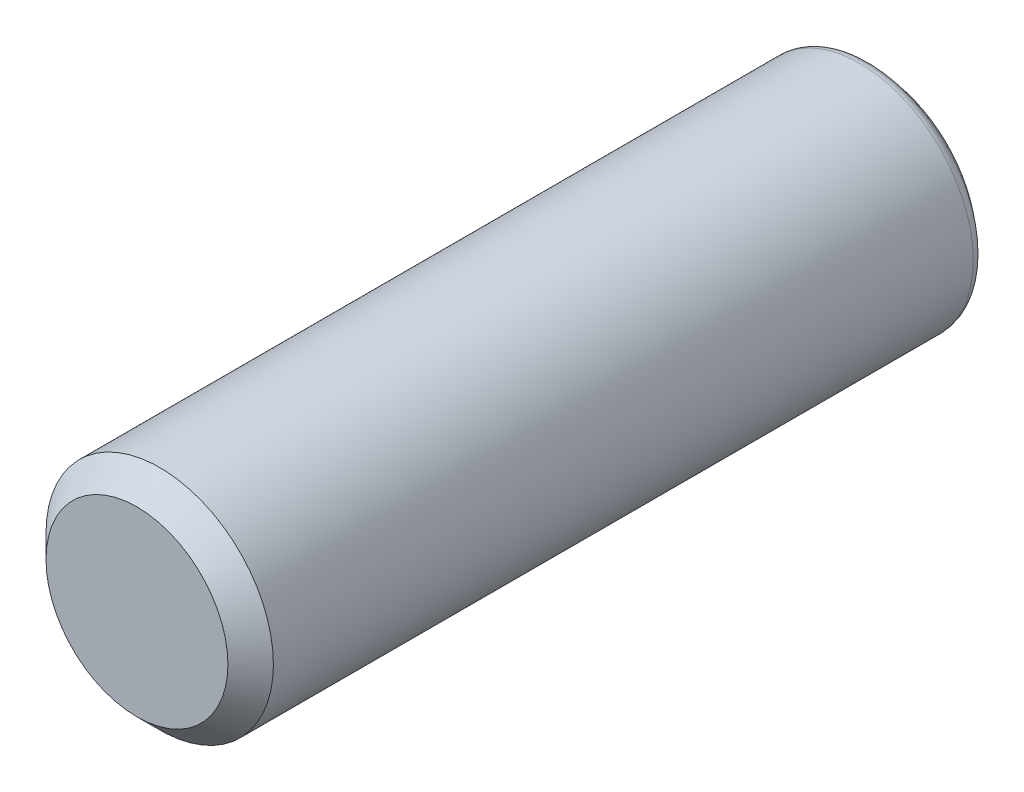
ISO-10303-21;
HEADER;
FILE_DESCRIPTION(('STEP AP214'),'2;1');
FILE_NAME('part.step','',(''),(''),'','','');
FILE_SCHEMA(('AUTOMOTIVE_DESIGN { 1 0 10303 214 1 1 1 1 }'));
ENDSEC;
DATA;
#1=APPLICATION_CONTEXT('core data for automotive mechanical design processes');
#2=APPLICATION_PROTOCOL_DEFINITION('international standard','automotive_design',2000,#1);
#3=PRODUCT_CONTEXT('',#1,'mechanical');
#4=PRODUCT('Part','Part','',(#3));
#5=PRODUCT_RELATED_PRODUCT_CATEGORY('part','',(#4));
#6=PRODUCT_DEFINITION_FORMATION('','',#4);
#7=PRODUCT_DEFINITION_CONTEXT('part definition',#1,'design');
#8=PRODUCT_DEFINITION('design','',#6,#7);
#9=PRODUCT_DEFINITION_SHAPE('','',#8);
#10=(LENGTH_UNIT() NAMED_UNIT(*) SI_UNIT(.MILLI.,.METRE.));
#11=(NAMED_UNIT(*) PLANE_ANGLE_UNIT() SI_UNIT($,.RADIAN.));
#12=(NAMED_UNIT(*) SI_UNIT($,.STERADIAN.) SOLID_ANGLE_UNIT());
#13=UNCERTAINTY_MEASURE_WITH_UNIT(LENGTH_MEASURE(1.E-05),#10,'distance_accuracy_value','');
#14=(GEOMETRIC_REPRESENTATION_CONTEXT(3) GLOBAL_UNCERTAINTY_ASSIGNED_CONTEXT((#13)) GLOBAL_UNIT_ASSIGNED_CONTEXT((#10,
#11,#12)) REPRESENTATION_CONTEXT('',''));
#15=CARTESIAN_POINT('',(0.,0.,0.));
#16=DIRECTION('',(0.,0.,1.));
#17=DIRECTION('',(1.,0.,0.));
#18=AXIS2_PLACEMENT_3D('',#15,#16,#17);
#19=CARTESIAN_POINT('',(0.,0.,32.));
#20=DIRECTION('',(0.,0.,-1.));
#21=DIRECTION('',(-1.,0.,0.));
#22=AXIS2_PLACEMENT_3D('',#19,#20,#21);
#23=CYLINDRICAL_SURFACE('',#22,5.00000000000001);
#24=CARTESIAN_POINT('',(0.,0.,0.21884705062547));
#25=DIRECTION('',(0.,0.,1.));
#26=DIRECTION('',(1.,0.,0.));
#27=AXIS2_PLACEMENT_3D('',#24,#25,#26);
#28=CIRCLE('',#27,5.00000000000001);
#29=CARTESIAN_POINT('',(5.00000000000001,0.,0.21884705062547));
#30=VERTEX_POINT('',#29);
#31=EDGE_CURVE('E38',#30,#30,#28,.T.);
#32=ORIENTED_EDGE('',*,*,#31,.T.);
#33=EDGE_LOOP('',(#32));
#34=FACE_BOUND('',#33,.T.);
#35=CARTESIAN_POINT('',(0.,0.,31.));
#36=DIRECTION('',(0.,0.,1.));
#37=DIRECTION('',(1.,0.,0.));
#38=AXIS2_PLACEMENT_3D('',#35,#36,#37);
#39=CIRCLE('',#38,5.00000000000001);
#40=CARTESIAN_POINT('',(5.00000000000001,0.,31.));
#41=VERTEX_POINT('',#40);
#42=EDGE_CURVE('E42',#41,#41,#39,.F.);
#43=ORIENTED_EDGE('',*,*,#42,.T.);
#44=EDGE_LOOP('',(#43));
#45=FACE_BOUND('',#44,.T.);
#46=ADVANCED_FACE('F31',(#34,#45),#23,.T.);
#47=CARTESIAN_POINT('',(0.,0.,32.));
#48=DIRECTION('',(0.,0.,1.));
#49=DIRECTION('',(1.,0.,0.));
#50=AXIS2_PLACEMENT_3D('',#47,#48,#49);
#51=PLANE('',#50);
#52=CARTESIAN_POINT('',(0.,0.,32.));
#53=DIRECTION('',(0.,0.,1.));
#54=DIRECTION('',(1.,0.,0.));
#55=AXIS2_PLACEMENT_3D('',#52,#53,#54);
#56=CIRCLE('',#55,3.99999999999999);
#57=CARTESIAN_POINT('',(3.99999999999999,0.,32.));
#58=VERTEX_POINT('',#57);
#59=EDGE_CURVE('E46',#58,#58,#56,.T.);
#60=ORIENTED_EDGE('',*,*,#59,.T.);
#61=EDGE_LOOP('',(#60));
#62=FACE_BOUND('',#61,.T.);
#63=ADVANCED_FACE('F52',(#62),#51,.T.);
#64=CARTESIAN_POINT('',(0.,0.,5.25000000000001));
#65=DIRECTION('',(0.,0.,1.));
#66=DIRECTION('',(1.,0.,0.));
#67=AXIS2_PLACEMENT_3D('',#64,#65,#66);
#68=SPHERICAL_SURFACE('',#67,7.25000000000001);
#69=CARTESIAN_POINT('',(0.,0.,-0.153830945624493));
#70=DIRECTION('',(0.,0.,1.));
#71=DIRECTION('',(1.,0.,0.));
#72=AXIS2_PLACEMENT_3D('',#69,#70,#71);
#73=CIRCLE('',#72,4.83333333333334);
#74=CARTESIAN_POINT('',(4.83333333333334,0.,-0.153830945624493));
#75=VERTEX_POINT('',#74);
#76=EDGE_CURVE('E10',#75,#75,#73,.F.);
#77=ORIENTED_EDGE('',*,*,#76,.T.);
#78=EDGE_LOOP('',(#77));
#79=FACE_BOUND('',#78,.T.);
#80=ADVANCED_FACE('F33',(#79),#68,.T.);
#81=CARTESIAN_POINT('',(0.,0.,32.));
#82=DIRECTION('',(0.,0.,-1.));
#83=DIRECTION('',(-1.,0.,0.));
#84=AXIS2_PLACEMENT_3D('',#81,#82,#83);
#85=CONICAL_SURFACE('',#84,3.99999999999999,0.785398163397453);
#86=ORIENTED_EDGE('',*,*,#42,.F.);
#87=EDGE_LOOP('',(#86));
#88=FACE_BOUND('',#87,.T.);
#89=ORIENTED_EDGE('',*,*,#59,.F.);
#90=EDGE_LOOP('',(#89));
#91=FACE_BOUND('',#90,.T.);
#92=ADVANCED_FACE('F54',(#88,#91),#85,.T.);
#93=CARTESIAN_POINT('',(0.,0.,0.218847050625473));
#94=DIRECTION('',(0.,0.,1.));
#95=DIRECTION('',(1.,0.,0.));
#96=AXIS2_PLACEMENT_3D('',#93,#94,#95);
#97=TOROIDAL_SURFACE('',#96,4.50000000000001,0.5);
#98=ORIENTED_EDGE('',*,*,#76,.F.);
#99=EDGE_LOOP('',(#98));
#100=FACE_BOUND('',#99,.T.);
#101=ORIENTED_EDGE('',*,*,#31,.F.);
#102=EDGE_LOOP('',(#101));
#103=FACE_BOUND('',#102,.T.);
#104=ADVANCED_FACE('F56',(#100,#103),#97,.T.);
#105=CLOSED_SHELL('',(#46,#63,#80,#92,#104));
#106=MANIFOLD_SOLID_BREP('B2',#105);
#107=ADVANCED_BREP_SHAPE_REPRESENTATION('',(#18,#106),#14);
#108=SHAPE_DEFINITION_REPRESENTATION(#9,#107);
ENDSEC;
END-ISO-10303-21;
